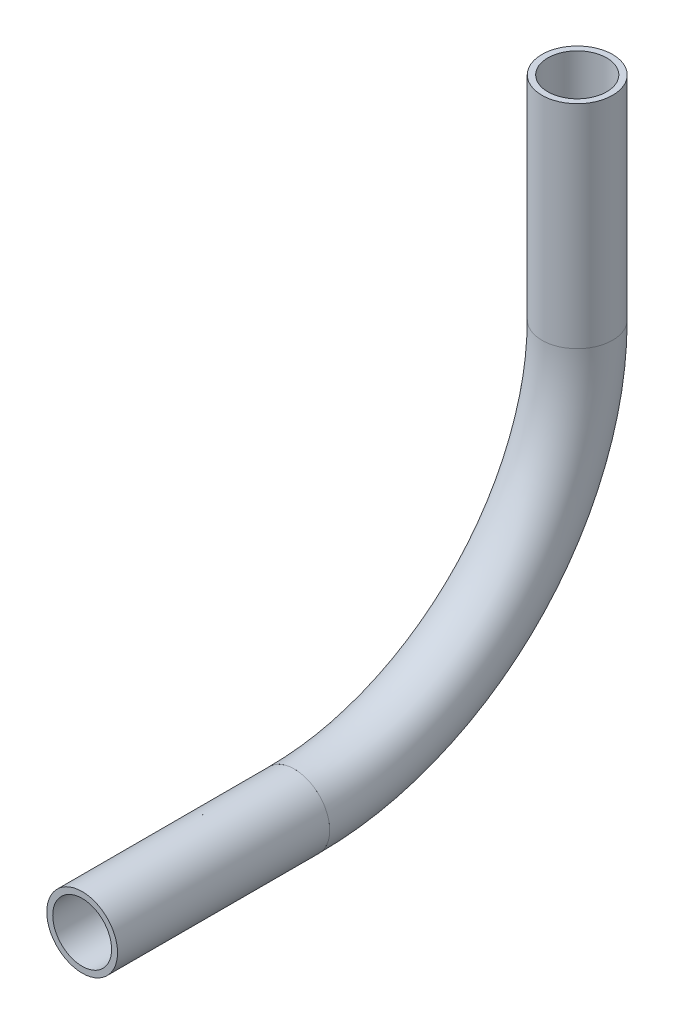
ISO-10303-21;
HEADER;
FILE_DESCRIPTION(('STEP AP214'),'2;1');
FILE_NAME('part.step','',(''),(''),'','','');
FILE_SCHEMA(('AUTOMOTIVE_DESIGN { 1 0 10303 214 1 1 1 1 }'));
ENDSEC;
DATA;
#1=APPLICATION_CONTEXT('core data for automotive mechanical design processes');
#2=APPLICATION_PROTOCOL_DEFINITION('international standard','automotive_design',2000,#1);
#3=PRODUCT_CONTEXT('',#1,'mechanical');
#4=PRODUCT('Part','Part','',(#3));
#5=PRODUCT_RELATED_PRODUCT_CATEGORY('part','',(#4));
#6=PRODUCT_DEFINITION_FORMATION('','',#4);
#7=PRODUCT_DEFINITION_CONTEXT('part definition',#1,'design');
#8=PRODUCT_DEFINITION('design','',#6,#7);
#9=PRODUCT_DEFINITION_SHAPE('','',#8);
#10=(LENGTH_UNIT() NAMED_UNIT(*) SI_UNIT(.MILLI.,.METRE.));
#11=(NAMED_UNIT(*) PLANE_ANGLE_UNIT() SI_UNIT($,.RADIAN.));
#12=(NAMED_UNIT(*) SI_UNIT($,.STERADIAN.) SOLID_ANGLE_UNIT());
#13=UNCERTAINTY_MEASURE_WITH_UNIT(LENGTH_MEASURE(1.E-05),#10,'distance_accuracy_value','');
#14=(GEOMETRIC_REPRESENTATION_CONTEXT(3) GLOBAL_UNCERTAINTY_ASSIGNED_CONTEXT((#13)) GLOBAL_UNIT_ASSIGNED_CONTEXT((#10,
#11,#12)) REPRESENTATION_CONTEXT('',''));
#15=CARTESIAN_POINT('',(0.,0.,0.));
#16=DIRECTION('',(0.,0.,1.));
#17=DIRECTION('',(1.,0.,0.));
#18=AXIS2_PLACEMENT_3D('',#15,#16,#17);
#19=CARTESIAN_POINT('',(0.,-225.948883234106,259.179579455468));
#20=DIRECTION('',(0.,1.,0.));
#21=DIRECTION('',(0.,0.,1.));
#22=AXIS2_PLACEMENT_3D('',#19,#20,#21);
#23=CYLINDRICAL_SURFACE('',#22,5.28319999999999);
#24=CARTESIAN_POINT('',(0.,-187.848883234106,259.179579455468));
#25=DIRECTION('',(0.,-1.,0.));
#26=DIRECTION('',(0.,0.,-1.));
#27=AXIS2_PLACEMENT_3D('',#24,#25,#26);
#28=CIRCLE('',#27,5.28319999999999);
#29=CARTESIAN_POINT('',(0.,-187.848883234106,253.896379455468));
#30=VERTEX_POINT('',#29);
#31=EDGE_CURVE('E54',#30,#30,#28,.T.);
#32=ORIENTED_EDGE('',*,*,#31,.F.);
#33=EDGE_LOOP('',(#32));
#34=FACE_BOUND('',#33,.T.);
#35=CARTESIAN_POINT('',(0.,-225.948883234106,259.179579455468));
#36=DIRECTION('',(0.,-1.,0.));
#37=DIRECTION('',(0.,0.,-1.));
#38=AXIS2_PLACEMENT_3D('',#35,#36,#37);
#39=CIRCLE('',#38,5.28319999999999);
#40=CARTESIAN_POINT('',(0.,-225.948883234106,253.896379455468));
#41=VERTEX_POINT('',#40);
#42=EDGE_CURVE('E50',#41,#41,#39,.T.);
#43=ORIENTED_EDGE('',*,*,#42,.T.);
#44=EDGE_LOOP('',(#43));
#45=FACE_BOUND('',#44,.T.);
#46=ADVANCED_FACE('F46',(#34,#45),#23,.F.);
#47=CARTESIAN_POINT('',(0.,-225.948883234106,259.179579455468));
#48=DIRECTION('',(0.,1.,0.));
#49=DIRECTION('',(0.,0.,1.));
#50=AXIS2_PLACEMENT_3D('',#47,#48,#49);
#51=CYLINDRICAL_SURFACE('',#50,6.35);
#52=CARTESIAN_POINT('',(0.,-187.848883234106,259.179579455468));
#53=DIRECTION('',(0.,-1.,0.));
#54=DIRECTION('',(0.,0.,-1.));
#55=AXIS2_PLACEMENT_3D('',#52,#53,#54);
#56=CIRCLE('',#55,6.35);
#57=CARTESIAN_POINT('',(0.,-187.848883234106,252.829579455468));
#58=VERTEX_POINT('',#57);
#59=EDGE_CURVE('E58',#58,#58,#56,.T.);
#60=ORIENTED_EDGE('',*,*,#59,.T.);
#61=EDGE_LOOP('',(#60));
#62=FACE_BOUND('',#61,.T.);
#63=CARTESIAN_POINT('',(0.,-225.948883234106,259.179579455468));
#64=DIRECTION('',(0.,-1.,0.));
#65=DIRECTION('',(0.,0.,-1.));
#66=AXIS2_PLACEMENT_3D('',#63,#64,#65);
#67=CIRCLE('',#66,6.35);
#68=CARTESIAN_POINT('',(0.,-225.948883234106,252.829579455468));
#69=VERTEX_POINT('',#68);
#70=EDGE_CURVE('E12',#69,#69,#67,.T.);
#71=ORIENTED_EDGE('',*,*,#70,.F.);
#72=EDGE_LOOP('',(#71));
#73=FACE_BOUND('',#72,.T.);
#74=ADVANCED_FACE('F73',(#62,#73),#51,.T.);
#75=CARTESIAN_POINT('',(0.,-187.848883234106,259.179579455468));
#76=DIRECTION('',(0.,-1.,0.));
#77=DIRECTION('',(0.,0.,-1.));
#78=AXIS2_PLACEMENT_3D('',#75,#76,#77);
#79=PLANE('',#78);
#80=ORIENTED_EDGE('',*,*,#31,.T.);
#81=EDGE_LOOP('',(#80));
#82=FACE_BOUND('',#81,.T.);
#83=ORIENTED_EDGE('',*,*,#59,.F.);
#84=EDGE_LOOP('',(#83));
#85=FACE_BOUND('',#84,.T.);
#86=ADVANCED_FACE('F69',(#82,#85),#79,.F.);
#87=CARTESIAN_POINT('',(0.,-225.948883234106,259.179579455468));
#88=DIRECTION('',(0.,-1.,0.));
#89=DIRECTION('',(0.,0.,-1.));
#90=AXIS2_PLACEMENT_3D('',#87,#88,#89);
#91=PLANE('',#90);
#92=ORIENTED_EDGE('',*,*,#42,.F.);
#93=EDGE_LOOP('',(#92));
#94=FACE_BOUND('',#93,.T.);
#95=ORIENTED_EDGE('',*,*,#70,.T.);
#96=EDGE_LOOP('',(#95));
#97=FACE_BOUND('',#96,.T.);
#98=ADVANCED_FACE('F48',(#94,#97),#91,.T.);
#99=CLOSED_SHELL('',(#46,#74,#86,#98));
#100=MANIFOLD_SOLID_BREP('B2',#99);
#101=CARTESIAN_POINT('',(0.,-225.948883234106,309.979579455468));
#102=DIRECTION('',(1.,0.,0.));
#103=DIRECTION('',(0.,0.,-1.));
#104=AXIS2_PLACEMENT_3D('',#101,#102,#103);
#105=TOROIDAL_SURFACE('',#104,50.8,5.28319999999999);
#106=CARTESIAN_POINT('',(0.,-276.748883234106,309.979579455468));
#107=DIRECTION('',(0.,0.,1.));
#108=DIRECTION('',(0.,-1.,0.));
#109=AXIS2_PLACEMENT_3D('',#106,#107,#108);
#110=CIRCLE('',#109,5.28319999999999);
#111=CARTESIAN_POINT('',(0.,-282.032083234106,309.979579455468));
#112=VERTEX_POINT('',#111);
#113=EDGE_CURVE('E149',#112,#112,#110,.T.);
#114=CARTESIAN_POINT('',(0.,-225.948883234106,259.179579455468));
#115=DIRECTION('',(0.,1.,0.));
#116=DIRECTION('',(0.,0.,1.));
#117=AXIS2_PLACEMENT_3D('',#114,#115,#116);
#118=CIRCLE('',#117,5.28319999999999);
#119=CARTESIAN_POINT('',(0.,-225.948883234106,253.896379455468));
#120=VERTEX_POINT('',#119);
#121=EDGE_CURVE('E139',#120,#120,#118,.T.);
#122=CARTESIAN_POINT('',(0.,-225.948883234106,309.979579455468));
#123=DIRECTION('',(1.,0.,0.));
#124=DIRECTION('',(0.,0.,-1.));
#125=AXIS2_PLACEMENT_3D('',#122,#123,#124);
#126=CIRCLE('',#125,56.0832);
#127=EDGE_CURVE('',#112,#120,#126,.T.);
#128=ORIENTED_EDGE('',*,*,#113,.T.);
#129=ORIENTED_EDGE('',*,*,#121,.T.);
#130=ORIENTED_EDGE('',*,*,#127,.T.);
#131=ORIENTED_EDGE('',*,*,#127,.F.);
#132=EDGE_LOOP('',(#128,#130,#129,#131));
#133=FACE_BOUND('',#132,.T.);
#134=ADVANCED_FACE('F135',(#133),#105,.F.);
#135=CARTESIAN_POINT('',(0.,-225.948883234106,309.979579455468));
#136=DIRECTION('',(1.,0.,0.));
#137=DIRECTION('',(0.,0.,-1.));
#138=AXIS2_PLACEMENT_3D('',#135,#136,#137);
#139=TOROIDAL_SURFACE('',#138,50.8,6.35);
#140=CARTESIAN_POINT('',(0.,-276.748883234106,309.979579455468));
#141=DIRECTION('',(0.,0.,1.));
#142=DIRECTION('',(0.,-1.,0.));
#143=AXIS2_PLACEMENT_3D('',#140,#141,#142);
#144=CIRCLE('',#143,6.35);
#145=CARTESIAN_POINT('',(0.,-283.098883234106,309.979579455468));
#146=VERTEX_POINT('',#145);
#147=EDGE_CURVE('E143',#146,#146,#144,.T.);
#148=CARTESIAN_POINT('',(0.,-225.948883234106,259.179579455468));
#149=DIRECTION('',(0.,1.,0.));
#150=DIRECTION('',(0.,0.,1.));
#151=AXIS2_PLACEMENT_3D('',#148,#149,#150);
#152=CIRCLE('',#151,6.35);
#153=CARTESIAN_POINT('',(0.,-225.948883234106,252.829579455468));
#154=VERTEX_POINT('',#153);
#155=EDGE_CURVE('E45',#154,#154,#152,.T.);
#156=CARTESIAN_POINT('',(0.,-225.948883234106,309.979579455468));
#157=DIRECTION('',(1.,0.,0.));
#158=DIRECTION('',(0.,0.,-1.));
#159=AXIS2_PLACEMENT_3D('',#156,#157,#158);
#160=CIRCLE('',#159,57.15);
#161=EDGE_CURVE('',#146,#154,#160,.T.);
#162=ORIENTED_EDGE('',*,*,#147,.F.);
#163=ORIENTED_EDGE('',*,*,#155,.F.);
#164=ORIENTED_EDGE('',*,*,#161,.T.);
#165=ORIENTED_EDGE('',*,*,#161,.F.);
#166=EDGE_LOOP('',(#162,#164,#163,#165));
#167=FACE_BOUND('',#166,.T.);
#168=ADVANCED_FACE('F162',(#167),#139,.T.);
#169=CARTESIAN_POINT('',(0.,-276.748883234106,309.979579455468));
#170=DIRECTION('',(0.,0.,1.));
#171=DIRECTION('',(0.,-1.,0.));
#172=AXIS2_PLACEMENT_3D('',#169,#170,#171);
#173=PLANE('',#172);
#174=ORIENTED_EDGE('',*,*,#113,.F.);
#175=EDGE_LOOP('',(#174));
#176=FACE_BOUND('',#175,.T.);
#177=ORIENTED_EDGE('',*,*,#147,.T.);
#178=EDGE_LOOP('',(#177));
#179=FACE_BOUND('',#178,.T.);
#180=ADVANCED_FACE('F158',(#176,#179),#173,.T.);
#181=CARTESIAN_POINT('',(0.,-225.948883234106,259.179579455468));
#182=DIRECTION('',(0.,1.,0.));
#183=DIRECTION('',(0.,0.,1.));
#184=AXIS2_PLACEMENT_3D('',#181,#182,#183);
#185=PLANE('',#184);
#186=ORIENTED_EDGE('',*,*,#121,.F.);
#187=EDGE_LOOP('',(#186));
#188=FACE_BOUND('',#187,.T.);
#189=ORIENTED_EDGE('',*,*,#155,.T.);
#190=EDGE_LOOP('',(#189));
#191=FACE_BOUND('',#190,.T.);
#192=ADVANCED_FACE('F137',(#188,#191),#185,.T.);
#193=CLOSED_SHELL('',(#134,#168,#180,#192));
#194=MANIFOLD_SOLID_BREP('B7',#193);
#195=CARTESIAN_POINT('',(0.,-276.748883234106,348.079579455468));
#196=DIRECTION('',(0.,0.,-1.));
#197=DIRECTION('',(-1.,0.,0.));
#198=AXIS2_PLACEMENT_3D('',#195,#196,#197);
#199=CYLINDRICAL_SURFACE('',#198,5.28319999999999);
#200=CARTESIAN_POINT('',(0.,-276.748883234106,348.079579455468));
#201=DIRECTION('',(0.,0.,1.));
#202=DIRECTION('',(0.,-1.,0.));
#203=AXIS2_PLACEMENT_3D('',#200,#201,#202);
#204=CIRCLE('',#203,5.28319999999999);
#205=CARTESIAN_POINT('',(0.,-282.032083234106,348.079579455468));
#206=VERTEX_POINT('',#205);
#207=EDGE_CURVE('E233',#206,#206,#204,.T.);
#208=ORIENTED_EDGE('',*,*,#207,.T.);
#209=EDGE_LOOP('',(#208));
#210=FACE_BOUND('',#209,.T.);
#211=CARTESIAN_POINT('',(0.,-276.748883234106,309.979579455468));
#212=DIRECTION('',(0.,0.,-1.));
#213=DIRECTION('',(0.,1.,0.));
#214=AXIS2_PLACEMENT_3D('',#211,#212,#213);
#215=CIRCLE('',#214,5.28319999999999);
#216=CARTESIAN_POINT('',(0.,-271.465683234106,309.979579455468));
#217=VERTEX_POINT('',#216);
#218=EDGE_CURVE('E223',#217,#217,#215,.T.);
#219=ORIENTED_EDGE('',*,*,#218,.T.);
#220=EDGE_LOOP('',(#219));
#221=FACE_BOUND('',#220,.T.);
#222=ADVANCED_FACE('F219',(#210,#221),#199,.F.);
#223=CARTESIAN_POINT('',(0.,-276.748883234106,348.079579455468));
#224=DIRECTION('',(0.,0.,-1.));
#225=DIRECTION('',(-1.,0.,0.));
#226=AXIS2_PLACEMENT_3D('',#223,#224,#225);
#227=CYLINDRICAL_SURFACE('',#226,6.35);
#228=CARTESIAN_POINT('',(0.,-276.748883234106,348.079579455468));
#229=DIRECTION('',(0.,0.,1.));
#230=DIRECTION('',(0.,-1.,0.));
#231=AXIS2_PLACEMENT_3D('',#228,#229,#230);
#232=CIRCLE('',#231,6.35);
#233=CARTESIAN_POINT('',(0.,-283.098883234106,348.079579455468));
#234=VERTEX_POINT('',#233);
#235=EDGE_CURVE('E227',#234,#234,#232,.T.);
#236=ORIENTED_EDGE('',*,*,#235,.F.);
#237=EDGE_LOOP('',(#236));
#238=FACE_BOUND('',#237,.T.);
#239=CARTESIAN_POINT('',(0.,-276.748883234106,309.979579455468));
#240=DIRECTION('',(0.,0.,-1.));
#241=DIRECTION('',(0.,1.,0.));
#242=AXIS2_PLACEMENT_3D('',#239,#240,#241);
#243=CIRCLE('',#242,6.35);
#244=CARTESIAN_POINT('',(0.,-270.398883234106,309.979579455468));
#245=VERTEX_POINT('',#244);
#246=EDGE_CURVE('E134',#245,#245,#243,.T.);
#247=ORIENTED_EDGE('',*,*,#246,.F.);
#248=EDGE_LOOP('',(#247));
#249=FACE_BOUND('',#248,.T.);
#250=ADVANCED_FACE('F246',(#238,#249),#227,.T.);
#251=CARTESIAN_POINT('',(0.,-276.748883234106,348.079579455468));
#252=DIRECTION('',(0.,0.,1.));
#253=DIRECTION('',(0.,-1.,0.));
#254=AXIS2_PLACEMENT_3D('',#251,#252,#253);
#255=PLANE('',#254);
#256=ORIENTED_EDGE('',*,*,#207,.F.);
#257=EDGE_LOOP('',(#256));
#258=FACE_BOUND('',#257,.T.);
#259=ORIENTED_EDGE('',*,*,#235,.T.);
#260=EDGE_LOOP('',(#259));
#261=FACE_BOUND('',#260,.T.);
#262=ADVANCED_FACE('F242',(#258,#261),#255,.T.);
#263=CARTESIAN_POINT('',(0.,-276.748883234106,309.979579455468));
#264=DIRECTION('',(0.,0.,-1.));
#265=DIRECTION('',(0.,1.,0.));
#266=AXIS2_PLACEMENT_3D('',#263,#264,#265);
#267=PLANE('',#266);
#268=ORIENTED_EDGE('',*,*,#218,.F.);
#269=EDGE_LOOP('',(#268));
#270=FACE_BOUND('',#269,.T.);
#271=ORIENTED_EDGE('',*,*,#246,.T.);
#272=EDGE_LOOP('',(#271));
#273=FACE_BOUND('',#272,.T.);
#274=ADVANCED_FACE('F221',(#270,#273),#267,.T.);
#275=CLOSED_SHELL('',(#222,#250,#262,#274));
#276=MANIFOLD_SOLID_BREP('B40',#275);
#277=ADVANCED_BREP_SHAPE_REPRESENTATION('',(#18,#100,#194,#276),#14);
#278=SHAPE_DEFINITION_REPRESENTATION(#9,#277);
ENDSEC;
END-ISO-10303-21;
